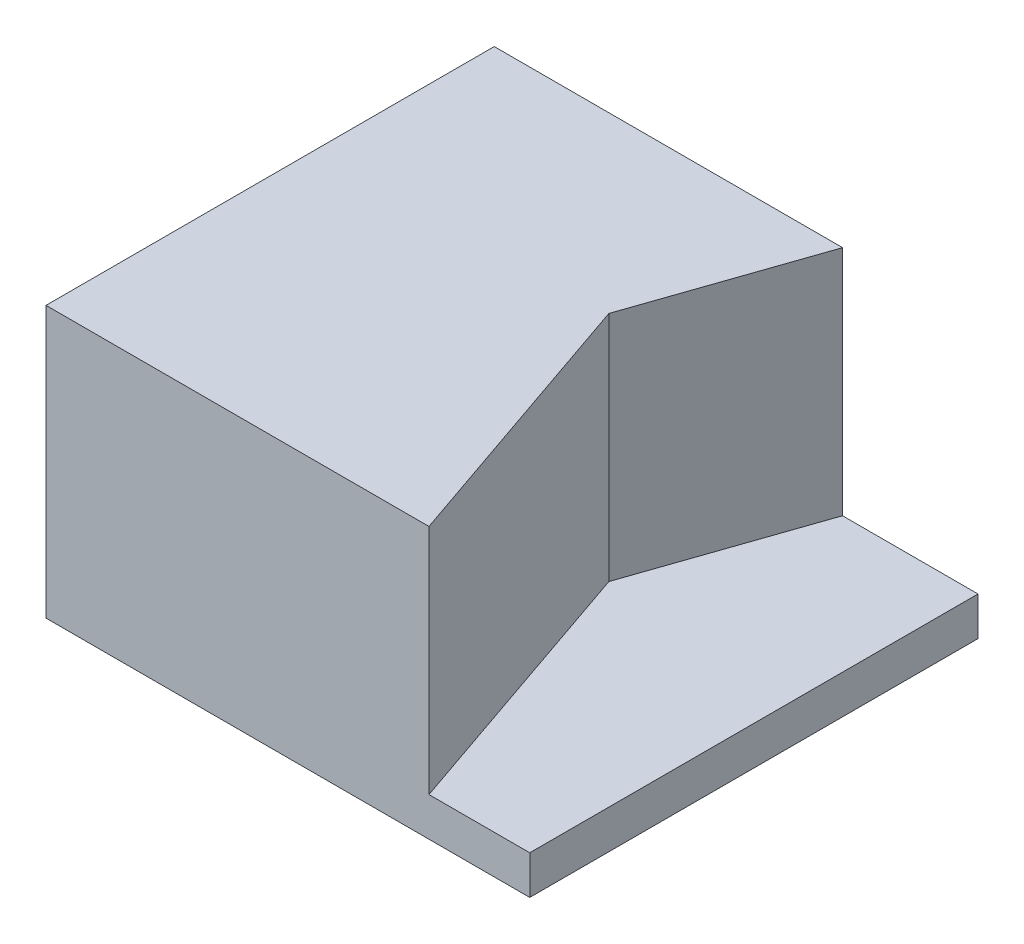
ISO-10303-21;
HEADER;
FILE_DESCRIPTION(('STEP AP214'),'2;1');
FILE_NAME('part.step','',(''),(''),'','','');
FILE_SCHEMA(('AUTOMOTIVE_DESIGN { 1 0 10303 214 1 1 1 1 }'));
ENDSEC;
DATA;
#1=APPLICATION_CONTEXT('core data for automotive mechanical design processes');
#2=APPLICATION_PROTOCOL_DEFINITION('international standard','automotive_design',2000,#1);
#3=PRODUCT_CONTEXT('',#1,'mechanical');
#4=PRODUCT('Part','Part','',(#3));
#5=PRODUCT_RELATED_PRODUCT_CATEGORY('part','',(#4));
#6=PRODUCT_DEFINITION_FORMATION('','',#4);
#7=PRODUCT_DEFINITION_CONTEXT('part definition',#1,'design');
#8=PRODUCT_DEFINITION('design','',#6,#7);
#9=PRODUCT_DEFINITION_SHAPE('','',#8);
#10=(LENGTH_UNIT() NAMED_UNIT(*) SI_UNIT(.MILLI.,.METRE.));
#11=(NAMED_UNIT(*) PLANE_ANGLE_UNIT() SI_UNIT($,.RADIAN.));
#12=(NAMED_UNIT(*) SI_UNIT($,.STERADIAN.) SOLID_ANGLE_UNIT());
#13=UNCERTAINTY_MEASURE_WITH_UNIT(LENGTH_MEASURE(1.E-05),#10,'distance_accuracy_value','');
#14=(GEOMETRIC_REPRESENTATION_CONTEXT(3) GLOBAL_UNCERTAINTY_ASSIGNED_CONTEXT((#13)) GLOBAL_UNIT_ASSIGNED_CONTEXT((#10,
#11,#12)) REPRESENTATION_CONTEXT('',''));
#15=CARTESIAN_POINT('',(0.,0.,0.));
#16=DIRECTION('',(0.,0.,1.));
#17=DIRECTION('',(1.,0.,0.));
#18=AXIS2_PLACEMENT_3D('',#15,#16,#17);
#19=CARTESIAN_POINT('',(248.082933696349,609.6,720.485154606681));
#20=DIRECTION('',(-0.945518575599319,0.,0.325568154457151));
#21=DIRECTION('',(0.325568154457151,0.,0.945518575599319));
#22=AXIS2_PLACEMENT_3D('',#19,#20,#21);
#23=PLANE('',#22);
#24=DIRECTION('',(-0.325568154457151,0.,-0.945518575599319));
#25=VECTOR('',#24,1.);
#26=CARTESIAN_POINT('',(248.082933696349,0.,720.485154606681));
#27=LINE('',#26,#25);
#28=CARTESIAN_POINT('',(248.082933696349,0.,720.485154606681));
#29=VERTEX_POINT('',#28);
#30=CARTESIAN_POINT('',(0.,0.,0.));
#31=VERTEX_POINT('',#30);
#32=EDGE_CURVE('E151',#29,#31,#27,.T.);
#33=ORIENTED_EDGE('',*,*,#32,.T.);
#34=DIRECTION('',(0.,-1.,0.));
#35=VECTOR('',#34,1.);
#36=CARTESIAN_POINT('',(0.,609.6,0.));
#37=LINE('',#36,#35);
#38=CARTESIAN_POINT('',(0.,609.6,0.));
#39=VERTEX_POINT('',#38);
#40=EDGE_CURVE('E11',#39,#31,#37,.T.);
#41=ORIENTED_EDGE('',*,*,#40,.F.);
#42=DIRECTION('',(-0.325568154457151,0.,-0.945518575599319));
#43=VECTOR('',#42,1.);
#44=CARTESIAN_POINT('',(248.082933696349,609.6,720.485154606681));
#45=LINE('',#44,#43);
#46=CARTESIAN_POINT('',(248.082933696349,609.6,720.485154606681));
#47=VERTEX_POINT('',#46);
#48=EDGE_CURVE('E152',#47,#39,#45,.T.);
#49=ORIENTED_EDGE('',*,*,#48,.F.);
#50=DIRECTION('',(0.,-1.,0.));
#51=VECTOR('',#50,1.);
#52=CARTESIAN_POINT('',(248.082933696349,609.6,720.485154606681));
#53=LINE('',#52,#51);
#54=EDGE_CURVE('E166',#47,#29,#53,.T.);
#55=ORIENTED_EDGE('',*,*,#54,.T.);
#56=EDGE_LOOP('',(#33,#41,#49,#55));
#57=FACE_BOUND('',#56,.T.);
#58=ADVANCED_FACE('F45',(#57),#23,.F.);
#59=CARTESIAN_POINT('',(0.,609.6,0.));
#60=DIRECTION('',(-0.945518575599319,0.,-0.32556815445715));
#61=DIRECTION('',(-0.32556815445715,0.,0.945518575599319));
#62=AXIS2_PLACEMENT_3D('',#59,#60,#61);
#63=PLANE('',#62);
#64=DIRECTION('',(0.32556815445715,0.,-0.945518575599319));
#65=VECTOR('',#64,1.);
#66=CARTESIAN_POINT('',(0.,0.,0.));
#67=LINE('',#66,#65);
#68=CARTESIAN_POINT('',(157.119191341021,0.,-456.307264584231));
#69=VERTEX_POINT('',#68);
#70=EDGE_CURVE('E156',#31,#69,#67,.T.);
#71=ORIENTED_EDGE('',*,*,#70,.T.);
#72=DIRECTION('',(0.,-1.,0.));
#73=VECTOR('',#72,1.);
#74=CARTESIAN_POINT('',(157.119191341021,609.6,-456.307264584231));
#75=LINE('',#74,#73);
#76=CARTESIAN_POINT('',(157.119191341021,609.6,-456.307264584231));
#77=VERTEX_POINT('',#76);
#78=EDGE_CURVE('E54',#77,#69,#75,.T.);
#79=ORIENTED_EDGE('',*,*,#78,.F.);
#80=DIRECTION('',(0.32556815445715,0.,-0.945518575599319));
#81=VECTOR('',#80,1.);
#82=CARTESIAN_POINT('',(0.,609.6,0.));
#83=LINE('',#82,#81);
#84=EDGE_CURVE('E155',#39,#77,#83,.T.);
#85=ORIENTED_EDGE('',*,*,#84,.F.);
#86=ORIENTED_EDGE('',*,*,#40,.T.);
#87=EDGE_LOOP('',(#71,#79,#85,#86));
#88=FACE_BOUND('',#87,.T.);
#89=ADVANCED_FACE('F181',(#88),#63,.F.);
#90=CARTESIAN_POINT('',(157.119191341021,609.6,-456.307264584231));
#91=DIRECTION('',(0.,0.,1.));
#92=DIRECTION('',(1.,0.,0.));
#93=AXIS2_PLACEMENT_3D('',#90,#91,#92);
#94=PLANE('',#93);
#95=ORIENTED_EDGE('',*,*,#78,.T.);
#96=DIRECTION('',(1.,0.,0.));
#97=VECTOR('',#96,1.);
#98=CARTESIAN_POINT('',(-757.280808658979,0.,-456.307264584231));
#99=LINE('',#98,#97);
#100=CARTESIAN_POINT('',(512.719191341021,0.,-456.307264584231));
#101=VERTEX_POINT('',#100);
#102=EDGE_CURVE('E141',#69,#101,#99,.T.);
#103=ORIENTED_EDGE('',*,*,#102,.T.);
#104=DIRECTION('',(0.,1.,0.));
#105=VECTOR('',#104,1.);
#106=CARTESIAN_POINT('',(512.719191341021,-101.6,-456.307264584231));
#107=LINE('',#106,#105);
#108=CARTESIAN_POINT('',(512.719191341021,-101.6,-456.307264584231));
#109=VERTEX_POINT('',#108);
#110=EDGE_CURVE('E118',#109,#101,#107,.T.);
#111=ORIENTED_EDGE('',*,*,#110,.F.);
#112=DIRECTION('',(1.,0.,0.));
#113=VECTOR('',#112,1.);
#114=CARTESIAN_POINT('',(-757.280808658979,-101.6,-456.307264584231));
#115=LINE('',#114,#113);
#116=CARTESIAN_POINT('',(-757.280808658979,-101.6,-456.307264584231));
#117=VERTEX_POINT('',#116);
#118=EDGE_CURVE('E114',#117,#109,#115,.T.);
#119=ORIENTED_EDGE('',*,*,#118,.F.);
#120=DIRECTION('',(0.,-1.,0.));
#121=VECTOR('',#120,1.);
#122=CARTESIAN_POINT('',(-757.280808658979,609.6,-456.307264584231));
#123=LINE('',#122,#121);
#124=CARTESIAN_POINT('',(-757.280808658979,609.6,-456.307264584231));
#125=VERTEX_POINT('',#124);
#126=EDGE_CURVE('E101',#125,#117,#123,.T.);
#127=ORIENTED_EDGE('',*,*,#126,.F.);
#128=DIRECTION('',(-1.,0.,0.));
#129=VECTOR('',#128,1.);
#130=CARTESIAN_POINT('',(157.119191341021,609.6,-456.307264584231));
#131=LINE('',#130,#129);
#132=EDGE_CURVE('E159',#77,#125,#131,.T.);
#133=ORIENTED_EDGE('',*,*,#132,.F.);
#134=EDGE_LOOP('',(#95,#103,#111,#119,#127,#133));
#135=FACE_BOUND('',#134,.T.);
#136=ADVANCED_FACE('F116',(#135),#94,.F.);
#137=CARTESIAN_POINT('',(-757.280808658979,609.6,-456.307264584231));
#138=DIRECTION('',(1.,0.,0.));
#139=DIRECTION('',(0.,0.,-1.));
#140=AXIS2_PLACEMENT_3D('',#137,#138,#139);
#141=PLANE('',#140);
#142=ORIENTED_EDGE('',*,*,#126,.T.);
#143=DIRECTION('',(0.,0.,-1.));
#144=VECTOR('',#143,1.);
#145=CARTESIAN_POINT('',(-757.280808658979,-101.6,720.485154606681));
#146=LINE('',#145,#144);
#147=CARTESIAN_POINT('',(-757.280808658979,-101.6,720.485154606681));
#148=VERTEX_POINT('',#147);
#149=EDGE_CURVE('E106',#148,#117,#146,.T.);
#150=ORIENTED_EDGE('',*,*,#149,.F.);
#151=DIRECTION('',(0.,-1.,0.));
#152=VECTOR('',#151,1.);
#153=CARTESIAN_POINT('',(-757.280808658979,609.6,720.485154606681));
#154=LINE('',#153,#152);
#155=CARTESIAN_POINT('',(-757.280808658979,609.6,720.485154606681));
#156=VERTEX_POINT('',#155);
#157=EDGE_CURVE('E111',#156,#148,#154,.T.);
#158=ORIENTED_EDGE('',*,*,#157,.F.);
#159=DIRECTION('',(0.,0.,1.));
#160=VECTOR('',#159,1.);
#161=CARTESIAN_POINT('',(-757.280808658979,609.6,-456.307264584231));
#162=LINE('',#161,#160);
#163=EDGE_CURVE('E107',#125,#156,#162,.T.);
#164=ORIENTED_EDGE('',*,*,#163,.F.);
#165=EDGE_LOOP('',(#142,#150,#158,#164));
#166=FACE_BOUND('',#165,.T.);
#167=ADVANCED_FACE('F103',(#166),#141,.F.);
#168=CARTESIAN_POINT('',(-757.280808658979,609.6,720.485154606681));
#169=DIRECTION('',(0.,0.,-1.));
#170=DIRECTION('',(-1.,0.,0.));
#171=AXIS2_PLACEMENT_3D('',#168,#169,#170);
#172=PLANE('',#171);
#173=ORIENTED_EDGE('',*,*,#157,.T.);
#174=DIRECTION('',(-1.,0.,0.));
#175=VECTOR('',#174,1.);
#176=CARTESIAN_POINT('',(-757.280808658979,-101.6,720.485154606681));
#177=LINE('',#176,#175);
#178=CARTESIAN_POINT('',(512.719191341021,-101.6,720.485154606681));
#179=VERTEX_POINT('',#178);
#180=EDGE_CURVE('E127',#179,#148,#177,.T.);
#181=ORIENTED_EDGE('',*,*,#180,.F.);
#182=DIRECTION('',(0.,1.,0.));
#183=VECTOR('',#182,1.);
#184=CARTESIAN_POINT('',(512.719191341021,-101.6,720.485154606681));
#185=LINE('',#184,#183);
#186=CARTESIAN_POINT('',(512.719191341021,0.,720.485154606681));
#187=VERTEX_POINT('',#186);
#188=EDGE_CURVE('E140',#179,#187,#185,.T.);
#189=ORIENTED_EDGE('',*,*,#188,.T.);
#190=DIRECTION('',(-1.,0.,0.));
#191=VECTOR('',#190,1.);
#192=CARTESIAN_POINT('',(-757.280808658979,0.,720.485154606681));
#193=LINE('',#192,#191);
#194=EDGE_CURVE('E129',#187,#29,#193,.T.);
#195=ORIENTED_EDGE('',*,*,#194,.T.);
#196=ORIENTED_EDGE('',*,*,#54,.F.);
#197=DIRECTION('',(1.,0.,0.));
#198=VECTOR('',#197,1.);
#199=CARTESIAN_POINT('',(-757.280808658979,609.6,720.485154606681));
#200=LINE('',#199,#198);
#201=EDGE_CURVE('E61',#156,#47,#200,.T.);
#202=ORIENTED_EDGE('',*,*,#201,.F.);
#203=EDGE_LOOP('',(#173,#181,#189,#195,#196,#202));
#204=FACE_BOUND('',#203,.T.);
#205=ADVANCED_FACE('F191',(#204),#172,.F.);
#206=CARTESIAN_POINT('',(0.,609.6,0.));
#207=DIRECTION('',(0.,1.,0.));
#208=DIRECTION('',(0.,0.,1.));
#209=AXIS2_PLACEMENT_3D('',#206,#207,#208);
#210=PLANE('',#209);
#211=ORIENTED_EDGE('',*,*,#48,.T.);
#212=ORIENTED_EDGE('',*,*,#84,.T.);
#213=ORIENTED_EDGE('',*,*,#132,.T.);
#214=ORIENTED_EDGE('',*,*,#163,.T.);
#215=ORIENTED_EDGE('',*,*,#201,.T.);
#216=EDGE_LOOP('',(#211,#212,#213,#214,#215));
#217=FACE_BOUND('',#216,.T.);
#218=ADVANCED_FACE('F194',(#217),#210,.T.);
#219=CARTESIAN_POINT('',(512.719191341021,-101.6,720.485154606681));
#220=DIRECTION('',(-1.,0.,0.));
#221=DIRECTION('',(0.,0.,1.));
#222=AXIS2_PLACEMENT_3D('',#219,#220,#221);
#223=PLANE('',#222);
#224=DIRECTION('',(0.,0.,1.));
#225=VECTOR('',#224,1.);
#226=CARTESIAN_POINT('',(512.719191341021,0.,720.485154606681));
#227=LINE('',#226,#225);
#228=EDGE_CURVE('E133',#101,#187,#227,.T.);
#229=ORIENTED_EDGE('',*,*,#228,.T.);
#230=ORIENTED_EDGE('',*,*,#188,.F.);
#231=DIRECTION('',(0.,0.,1.));
#232=VECTOR('',#231,1.);
#233=CARTESIAN_POINT('',(512.719191341021,-101.6,720.485154606681));
#234=LINE('',#233,#232);
#235=EDGE_CURVE('E122',#109,#179,#234,.T.);
#236=ORIENTED_EDGE('',*,*,#235,.F.);
#237=ORIENTED_EDGE('',*,*,#110,.T.);
#238=EDGE_LOOP('',(#229,#230,#236,#237));
#239=FACE_BOUND('',#238,.T.);
#240=ADVANCED_FACE('F189',(#239),#223,.F.);
#241=CARTESIAN_POINT('',(0.,-101.6,0.));
#242=DIRECTION('',(0.,-1.,0.));
#243=DIRECTION('',(0.,0.,-1.));
#244=AXIS2_PLACEMENT_3D('',#241,#242,#243);
#245=PLANE('',#244);
#246=ORIENTED_EDGE('',*,*,#149,.T.);
#247=ORIENTED_EDGE('',*,*,#118,.T.);
#248=ORIENTED_EDGE('',*,*,#235,.T.);
#249=ORIENTED_EDGE('',*,*,#180,.T.);
#250=EDGE_LOOP('',(#246,#247,#248,#249));
#251=FACE_BOUND('',#250,.T.);
#252=ADVANCED_FACE('F125',(#251),#245,.T.);
#253=CARTESIAN_POINT('',(0.,0.,0.));
#254=DIRECTION('',(0.,-1.,0.));
#255=DIRECTION('',(0.,0.,-1.));
#256=AXIS2_PLACEMENT_3D('',#253,#254,#255);
#257=PLANE('',#256);
#258=ORIENTED_EDGE('',*,*,#32,.F.);
#259=ORIENTED_EDGE('',*,*,#194,.F.);
#260=ORIENTED_EDGE('',*,*,#228,.F.);
#261=ORIENTED_EDGE('',*,*,#102,.F.);
#262=ORIENTED_EDGE('',*,*,#70,.F.);
#263=EDGE_LOOP('',(#258,#259,#260,#261,#262));
#264=FACE_BOUND('',#263,.T.);
#265=ADVANCED_FACE('F184',(#264),#257,.F.);
#266=CLOSED_SHELL('',(#58,#89,#136,#167,#205,#218,#240,#252,#265));
#267=MANIFOLD_SOLID_BREP('B2',#266);
#268=ADVANCED_BREP_SHAPE_REPRESENTATION('',(#18,#267),#14);
#269=SHAPE_DEFINITION_REPRESENTATION(#9,#268);
ENDSEC;
END-ISO-10303-21;
